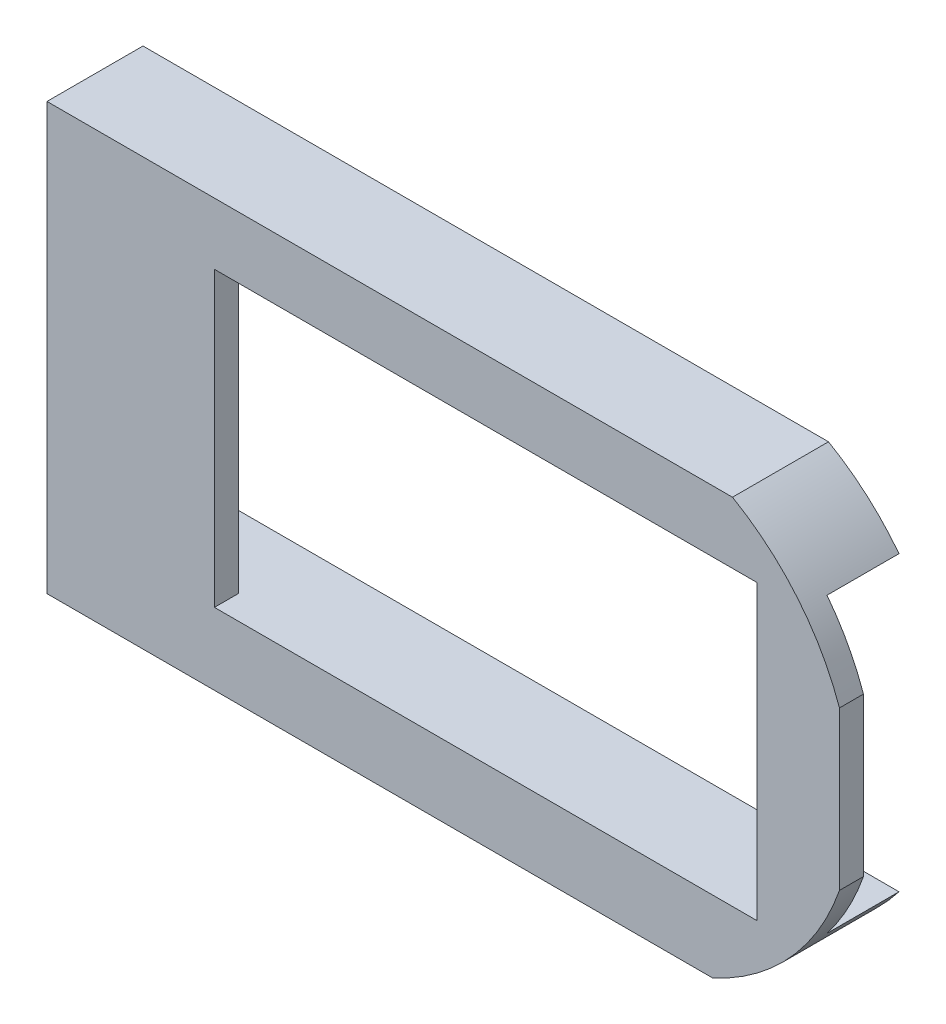
ISO-10303-21;
HEADER;
FILE_DESCRIPTION(('STEP AP214'),'2;1');
FILE_NAME('part.step','',(''),(''),'','','');
FILE_SCHEMA(('AUTOMOTIVE_DESIGN { 1 0 10303 214 1 1 1 1 }'));
ENDSEC;
DATA;
#1=APPLICATION_CONTEXT('core data for automotive mechanical design processes');
#2=APPLICATION_PROTOCOL_DEFINITION('international standard','automotive_design',2000,#1);
#3=PRODUCT_CONTEXT('',#1,'mechanical');
#4=PRODUCT('Part','Part','',(#3));
#5=PRODUCT_RELATED_PRODUCT_CATEGORY('part','',(#4));
#6=PRODUCT_DEFINITION_FORMATION('','',#4);
#7=PRODUCT_DEFINITION_CONTEXT('part definition',#1,'design');
#8=PRODUCT_DEFINITION('design','',#6,#7);
#9=PRODUCT_DEFINITION_SHAPE('','',#8);
#10=(LENGTH_UNIT() NAMED_UNIT(*) SI_UNIT(.MILLI.,.METRE.));
#11=(NAMED_UNIT(*) PLANE_ANGLE_UNIT() SI_UNIT($,.RADIAN.));
#12=(NAMED_UNIT(*) SI_UNIT($,.STERADIAN.) SOLID_ANGLE_UNIT());
#13=UNCERTAINTY_MEASURE_WITH_UNIT(LENGTH_MEASURE(1.E-05),#10,'distance_accuracy_value','');
#14=(GEOMETRIC_REPRESENTATION_CONTEXT(3) GLOBAL_UNCERTAINTY_ASSIGNED_CONTEXT((#13)) GLOBAL_UNIT_ASSIGNED_CONTEXT((#10,
#11,#12)) REPRESENTATION_CONTEXT('',''));
#15=CARTESIAN_POINT('',(0.,0.,0.));
#16=DIRECTION('',(0.,0.,1.));
#17=DIRECTION('',(1.,0.,0.));
#18=AXIS2_PLACEMENT_3D('',#15,#16,#17);
#19=CARTESIAN_POINT('',(80.,0.,23.5));
#20=DIRECTION('',(0.,0.,-1.));
#21=DIRECTION('',(-1.,0.,0.));
#22=AXIS2_PLACEMENT_3D('',#19,#20,#21);
#23=CYLINDRICAL_SURFACE('',#22,10.);
#24=DIRECTION('',(0.,0.,-1.));
#25=VECTOR('',#24,1.);
#26=CARTESIAN_POINT('',(84.9859105930687,8.66837329364195,23.5));
#27=LINE('',#26,#25);
#28=CARTESIAN_POINT('',(84.9859105930687,8.66837329364195,17.5));
#29=VERTEX_POINT('',#28);
#30=CARTESIAN_POINT('',(84.9859105930687,8.66837329364195,21.5));
#31=VERTEX_POINT('',#30);
#32=EDGE_CURVE('E561',#29,#31,#27,.F.);
#33=ORIENTED_EDGE('',*,*,#32,.T.);
#34=CARTESIAN_POINT('',(80.,0.,21.5));
#35=DIRECTION('',(0.,0.,1.));
#36=DIRECTION('',(1.,0.,0.));
#37=AXIS2_PLACEMENT_3D('',#34,#35,#36);
#38=CIRCLE('',#37,10.);
#39=CARTESIAN_POINT('',(89.4424999218973,3.29229330785836,21.5));
#40=VERTEX_POINT('',#39);
#41=EDGE_CURVE('E527',#31,#40,#38,.F.);
#42=ORIENTED_EDGE('',*,*,#41,.T.);
#43=DIRECTION('',(0.,0.,-1.));
#44=VECTOR('',#43,1.);
#45=CARTESIAN_POINT('',(89.4424999218973,3.29229330785836,23.5));
#46=LINE('',#45,#44);
#47=CARTESIAN_POINT('',(89.4424999218973,3.29229330785836,20.5));
#48=VERTEX_POINT('',#47);
#49=EDGE_CURVE('E547',#40,#48,#46,.T.);
#50=ORIENTED_EDGE('',*,*,#49,.T.);
#51=CARTESIAN_POINT('',(80.,0.,20.5));
#52=DIRECTION('',(0.,0.,1.));
#53=DIRECTION('',(1.,0.,0.));
#54=AXIS2_PLACEMENT_3D('',#51,#52,#53);
#55=CIRCLE('',#54,10.);
#56=CARTESIAN_POINT('',(87.924014134263,6.1,20.5));
#57=VERTEX_POINT('',#56);
#58=EDGE_CURVE('E587',#57,#48,#55,.F.);
#59=ORIENTED_EDGE('',*,*,#58,.F.);
#60=DIRECTION('',(0.,0.,-1.));
#61=VECTOR('',#60,1.);
#62=CARTESIAN_POINT('',(87.924014134263,6.1,23.5));
#63=LINE('',#62,#61);
#64=CARTESIAN_POINT('',(87.924014134263,6.1,17.5));
#65=VERTEX_POINT('',#64);
#66=EDGE_CURVE('E593',#65,#57,#63,.F.);
#67=ORIENTED_EDGE('',*,*,#66,.F.);
#68=CARTESIAN_POINT('',(80.,0.,17.5));
#69=DIRECTION('',(0.,0.,1.));
#70=DIRECTION('',(1.,0.,0.));
#71=AXIS2_PLACEMENT_3D('',#68,#69,#70);
#72=CIRCLE('',#71,10.);
#73=EDGE_CURVE('E625',#29,#65,#72,.F.);
#74=ORIENTED_EDGE('',*,*,#73,.F.);
#75=EDGE_LOOP('',(#33,#42,#50,#59,#67,#74));
#76=FACE_BOUND('',#75,.T.);
#77=ADVANCED_FACE('F424',(#76),#23,.T.);
#78=DIRECTION('',(0.,0.,-1.));
#79=VECTOR('',#78,1.);
#80=CARTESIAN_POINT('',(89.4424999218973,-3.29229330785836,23.5));
#81=LINE('',#80,#79);
#82=CARTESIAN_POINT('',(89.4424999218973,-3.29229330785836,20.5));
#83=VERTEX_POINT('',#82);
#84=CARTESIAN_POINT('',(89.4424999218973,-3.29229330785836,21.5));
#85=VERTEX_POINT('',#84);
#86=EDGE_CURVE('E558',#83,#85,#81,.F.);
#87=ORIENTED_EDGE('',*,*,#86,.T.);
#88=CARTESIAN_POINT('',(80.,0.,21.5));
#89=DIRECTION('',(0.,0.,1.));
#90=DIRECTION('',(1.,0.,0.));
#91=AXIS2_PLACEMENT_3D('',#88,#89,#90);
#92=CIRCLE('',#91,10.);
#93=CARTESIAN_POINT('',(84.1595211796978,-9.09386516040595,21.5));
#94=VERTEX_POINT('',#93);
#95=EDGE_CURVE('E446',#85,#94,#92,.F.);
#96=ORIENTED_EDGE('',*,*,#95,.T.);
#97=DIRECTION('',(0.,0.,-1.));
#98=VECTOR('',#97,1.);
#99=CARTESIAN_POINT('',(84.1595211796978,-9.09386516040595,23.5));
#100=LINE('',#99,#98);
#101=CARTESIAN_POINT('',(84.1595211796978,-9.09386516040595,17.5));
#102=VERTEX_POINT('',#101);
#103=EDGE_CURVE('E545',#94,#102,#100,.T.);
#104=ORIENTED_EDGE('',*,*,#103,.T.);
#105=CARTESIAN_POINT('',(80.,0.,17.5));
#106=DIRECTION('',(0.,0.,1.));
#107=DIRECTION('',(1.,0.,0.));
#108=AXIS2_PLACEMENT_3D('',#105,#106,#107);
#109=CIRCLE('',#108,10.);
#110=CARTESIAN_POINT('',(87.924014134263,-6.1,17.5));
#111=VERTEX_POINT('',#110);
#112=EDGE_CURVE('E623',#111,#102,#109,.F.);
#113=ORIENTED_EDGE('',*,*,#112,.F.);
#114=DIRECTION('',(0.,0.,-1.));
#115=VECTOR('',#114,1.);
#116=CARTESIAN_POINT('',(87.924014134263,-6.1,23.5));
#117=LINE('',#116,#115);
#118=CARTESIAN_POINT('',(87.924014134263,-6.1,20.5));
#119=VERTEX_POINT('',#118);
#120=EDGE_CURVE('E590',#119,#111,#117,.T.);
#121=ORIENTED_EDGE('',*,*,#120,.F.);
#122=EDGE_CURVE('E585',#83,#119,#55,.F.);
#123=ORIENTED_EDGE('',*,*,#122,.F.);
#124=EDGE_LOOP('',(#87,#96,#104,#113,#121,#123));
#125=FACE_BOUND('',#124,.T.);
#126=ADVANCED_FACE('F670',(#125),#23,.T.);
#127=CARTESIAN_POINT('',(0.,-6.1,-46.6829504163593));
#128=DIRECTION('',(0.,-1.,0.));
#129=DIRECTION('',(0.,0.,-1.));
#130=AXIS2_PLACEMENT_3D('',#127,#128,#129);
#131=PLANE('',#130);
#132=DIRECTION('',(-1.,0.,0.));
#133=VECTOR('',#132,1.);
#134=CARTESIAN_POINT('',(0.,-6.1,21.5));
#135=LINE('',#134,#133);
#136=CARTESIAN_POINT('',(86.,-6.1,21.5));
#137=VERTEX_POINT('',#136);
#138=CARTESIAN_POINT('',(63.4,-6.1,21.5));
#139=VERTEX_POINT('',#138);
#140=EDGE_CURVE('E438',#137,#139,#135,.T.);
#141=ORIENTED_EDGE('',*,*,#140,.F.);
#142=DIRECTION('',(0.,0.,-1.));
#143=VECTOR('',#142,1.);
#144=CARTESIAN_POINT('',(86.,-6.1,23.5));
#145=LINE('',#144,#143);
#146=CARTESIAN_POINT('',(86.,-6.1,20.5));
#147=VERTEX_POINT('',#146);
#148=EDGE_CURVE('E563',#137,#147,#145,.T.);
#149=ORIENTED_EDGE('',*,*,#148,.T.);
#150=DIRECTION('',(1.,0.,0.));
#151=VECTOR('',#150,1.);
#152=CARTESIAN_POINT('',(0.,-6.1,20.5));
#153=LINE('',#152,#151);
#154=EDGE_CURVE('E574',#147,#119,#153,.T.);
#155=ORIENTED_EDGE('',*,*,#154,.T.);
#156=ORIENTED_EDGE('',*,*,#120,.T.);
#157=DIRECTION('',(-1.,0.,0.));
#158=VECTOR('',#157,1.);
#159=CARTESIAN_POINT('',(0.,-6.1,17.5));
#160=LINE('',#159,#158);
#161=CARTESIAN_POINT('',(58.2,-6.1,17.5));
#162=VERTEX_POINT('',#161);
#163=EDGE_CURVE('E629',#111,#162,#160,.T.);
#164=ORIENTED_EDGE('',*,*,#163,.T.);
#165=DIRECTION('',(0.,0.,1.));
#166=VECTOR('',#165,1.);
#167=CARTESIAN_POINT('',(58.2,-6.1,-46.6829504163593));
#168=LINE('',#167,#166);
#169=CARTESIAN_POINT('',(58.2,-6.1,20.5));
#170=VERTEX_POINT('',#169);
#171=EDGE_CURVE('E582',#162,#170,#168,.T.);
#172=ORIENTED_EDGE('',*,*,#171,.T.);
#173=CARTESIAN_POINT('',(63.4,-6.1,20.5));
#174=VERTEX_POINT('',#173);
#175=EDGE_CURVE('E575',#170,#174,#153,.T.);
#176=ORIENTED_EDGE('',*,*,#175,.T.);
#177=DIRECTION('',(0.,0.,-1.));
#178=VECTOR('',#177,1.);
#179=CARTESIAN_POINT('',(63.4,-6.1,23.5));
#180=LINE('',#179,#178);
#181=EDGE_CURVE('E569',#139,#174,#180,.T.);
#182=ORIENTED_EDGE('',*,*,#181,.F.);
#183=EDGE_LOOP('',(#141,#149,#155,#156,#164,#172,#176,#182));
#184=FACE_BOUND('',#183,.T.);
#185=ADVANCED_FACE('F650',(#184),#131,.F.);
#186=CARTESIAN_POINT('',(0.,6.09999999999999,-46.6829504163593));
#187=DIRECTION('',(0.,1.,0.));
#188=DIRECTION('',(-1.,0.,0.));
#189=AXIS2_PLACEMENT_3D('',#186,#187,#188);
#190=PLANE('',#189);
#191=DIRECTION('',(1.,0.,0.));
#192=VECTOR('',#191,1.);
#193=CARTESIAN_POINT('',(0.,6.09999999999999,21.5));
#194=LINE('',#193,#192);
#195=CARTESIAN_POINT('',(63.4,6.1,21.5));
#196=VERTEX_POINT('',#195);
#197=CARTESIAN_POINT('',(86.,6.1,21.5));
#198=VERTEX_POINT('',#197);
#199=EDGE_CURVE('E612',#196,#198,#194,.T.);
#200=ORIENTED_EDGE('',*,*,#199,.F.);
#201=DIRECTION('',(0.,0.,-1.));
#202=VECTOR('',#201,1.);
#203=CARTESIAN_POINT('',(63.4,6.1,23.5));
#204=LINE('',#203,#202);
#205=CARTESIAN_POINT('',(63.4,6.1,20.5));
#206=VERTEX_POINT('',#205);
#207=EDGE_CURVE('E567',#196,#206,#204,.T.);
#208=ORIENTED_EDGE('',*,*,#207,.T.);
#209=DIRECTION('',(-1.,0.,0.));
#210=VECTOR('',#209,1.);
#211=CARTESIAN_POINT('',(0.,6.10000000000001,20.5));
#212=LINE('',#211,#210);
#213=CARTESIAN_POINT('',(58.2,6.1,20.5));
#214=VERTEX_POINT('',#213);
#215=EDGE_CURVE('E578',#206,#214,#212,.T.);
#216=ORIENTED_EDGE('',*,*,#215,.T.);
#217=DIRECTION('',(0.,0.,1.));
#218=VECTOR('',#217,1.);
#219=CARTESIAN_POINT('',(58.2,6.1,-46.6829504163593));
#220=LINE('',#219,#218);
#221=CARTESIAN_POINT('',(58.2,6.1,17.5));
#222=VERTEX_POINT('',#221);
#223=EDGE_CURVE('E583',#222,#214,#220,.T.);
#224=ORIENTED_EDGE('',*,*,#223,.F.);
#225=DIRECTION('',(1.,0.,0.));
#226=VECTOR('',#225,1.);
#227=CARTESIAN_POINT('',(0.,6.09999999999999,17.5));
#228=LINE('',#227,#226);
#229=EDGE_CURVE('E627',#222,#65,#228,.T.);
#230=ORIENTED_EDGE('',*,*,#229,.T.);
#231=ORIENTED_EDGE('',*,*,#66,.T.);
#232=CARTESIAN_POINT('',(86.,6.1,20.5));
#233=VERTEX_POINT('',#232);
#234=EDGE_CURVE('E579',#57,#233,#212,.T.);
#235=ORIENTED_EDGE('',*,*,#234,.T.);
#236=DIRECTION('',(0.,0.,-1.));
#237=VECTOR('',#236,1.);
#238=CARTESIAN_POINT('',(86.,6.1,23.5));
#239=LINE('',#238,#237);
#240=EDGE_CURVE('E564',#198,#233,#239,.T.);
#241=ORIENTED_EDGE('',*,*,#240,.F.);
#242=EDGE_LOOP('',(#200,#208,#216,#224,#230,#231,#235,#241));
#243=FACE_BOUND('',#242,.T.);
#244=ADVANCED_FACE('F640',(#243),#190,.F.);
#245=CARTESIAN_POINT('',(86.,6.1,23.5));
#246=DIRECTION('',(1.,0.,0.));
#247=DIRECTION('',(0.,0.,-1.));
#248=AXIS2_PLACEMENT_3D('',#245,#246,#247);
#249=PLANE('',#248);
#250=DIRECTION('',(0.,-1.,0.));
#251=VECTOR('',#250,1.);
#252=CARTESIAN_POINT('',(86.,6.1,21.5));
#253=LINE('',#252,#251);
#254=EDGE_CURVE('E619',#198,#137,#253,.T.);
#255=ORIENTED_EDGE('',*,*,#254,.F.);
#256=ORIENTED_EDGE('',*,*,#240,.T.);
#257=DIRECTION('',(0.,1.,0.));
#258=VECTOR('',#257,1.);
#259=CARTESIAN_POINT('',(86.,0.,20.5));
#260=LINE('',#259,#258);
#261=EDGE_CURVE('E598',#147,#233,#260,.T.);
#262=ORIENTED_EDGE('',*,*,#261,.F.);
#263=ORIENTED_EDGE('',*,*,#148,.F.);
#264=EDGE_LOOP('',(#255,#256,#262,#263));
#265=FACE_BOUND('',#264,.T.);
#266=ADVANCED_FACE('F659',(#265),#249,.F.);
#267=CARTESIAN_POINT('',(63.4,6.1,23.5));
#268=DIRECTION('',(-1.,0.,0.));
#269=DIRECTION('',(0.,0.,1.));
#270=AXIS2_PLACEMENT_3D('',#267,#268,#269);
#271=PLANE('',#270);
#272=DIRECTION('',(0.,1.,0.));
#273=VECTOR('',#272,1.);
#274=CARTESIAN_POINT('',(63.4,6.1,21.5));
#275=LINE('',#274,#273);
#276=EDGE_CURVE('E610',#139,#196,#275,.T.);
#277=ORIENTED_EDGE('',*,*,#276,.F.);
#278=ORIENTED_EDGE('',*,*,#181,.T.);
#279=DIRECTION('',(0.,-1.,0.));
#280=VECTOR('',#279,1.);
#281=CARTESIAN_POINT('',(63.4,0.,20.5));
#282=LINE('',#281,#280);
#283=EDGE_CURVE('E595',#206,#174,#282,.T.);
#284=ORIENTED_EDGE('',*,*,#283,.F.);
#285=ORIENTED_EDGE('',*,*,#207,.F.);
#286=EDGE_LOOP('',(#277,#278,#284,#285));
#287=FACE_BOUND('',#286,.T.);
#288=ADVANCED_FACE('F653',(#287),#271,.F.);
#289=CARTESIAN_POINT('',(56.4237927175313,-9.09386516040595,-22.1025588832576));
#290=DIRECTION('',(0.,-1.,0.));
#291=DIRECTION('',(0.,0.,-1.));
#292=AXIS2_PLACEMENT_3D('',#289,#290,#291);
#293=PLANE('',#292);
#294=ORIENTED_EDGE('',*,*,#103,.F.);
#295=DIRECTION('',(-1.,0.,0.));
#296=VECTOR('',#295,1.);
#297=CARTESIAN_POINT('',(56.4237927175313,-9.09386516040595,21.5));
#298=LINE('',#297,#296);
#299=CARTESIAN_POINT('',(56.4237927175313,-9.09386516040595,21.5));
#300=VERTEX_POINT('',#299);
#301=EDGE_CURVE('E609',#94,#300,#298,.T.);
#302=ORIENTED_EDGE('',*,*,#301,.T.);
#303=DIRECTION('',(0.,0.,1.));
#304=VECTOR('',#303,1.);
#305=CARTESIAN_POINT('',(56.4237927175313,-9.09386516040595,-22.1025588832576));
#306=LINE('',#305,#304);
#307=CARTESIAN_POINT('',(56.4237927175313,-9.09386516040595,17.5));
#308=VERTEX_POINT('',#307);
#309=EDGE_CURVE('E540',#308,#300,#306,.T.);
#310=ORIENTED_EDGE('',*,*,#309,.F.);
#311=DIRECTION('',(-1.,0.,0.));
#312=VECTOR('',#311,1.);
#313=CARTESIAN_POINT('',(56.4237927175313,-9.09386516040595,17.5));
#314=LINE('',#313,#312);
#315=EDGE_CURVE('E605',#102,#308,#314,.T.);
#316=ORIENTED_EDGE('',*,*,#315,.F.);
#317=EDGE_LOOP('',(#294,#302,#310,#316));
#318=FACE_BOUND('',#317,.T.);
#319=ADVANCED_FACE('F608',(#318),#293,.T.);
#320=CARTESIAN_POINT('',(56.4237927175313,8.66837329364195,-22.1025588832576));
#321=DIRECTION('',(0.,1.,0.));
#322=DIRECTION('',(0.,0.,1.));
#323=AXIS2_PLACEMENT_3D('',#320,#321,#322);
#324=PLANE('',#323);
#325=DIRECTION('',(0.,0.,1.));
#326=VECTOR('',#325,1.);
#327=CARTESIAN_POINT('',(56.4237927175313,8.66837329364195,-22.1025588832576));
#328=LINE('',#327,#326);
#329=CARTESIAN_POINT('',(56.4237927175313,8.66837329364195,17.5));
#330=VERTEX_POINT('',#329);
#331=CARTESIAN_POINT('',(56.4237927175313,8.66837329364195,21.5));
#332=VERTEX_POINT('',#331);
#333=EDGE_CURVE('E538',#330,#332,#328,.T.);
#334=ORIENTED_EDGE('',*,*,#333,.T.);
#335=DIRECTION('',(-1.,0.,0.));
#336=VECTOR('',#335,1.);
#337=CARTESIAN_POINT('',(56.4237927175313,8.66837329364195,21.5));
#338=LINE('',#337,#336);
#339=EDGE_CURVE('E521',#31,#332,#338,.T.);
#340=ORIENTED_EDGE('',*,*,#339,.F.);
#341=ORIENTED_EDGE('',*,*,#32,.F.);
#342=DIRECTION('',(1.,0.,0.));
#343=VECTOR('',#342,1.);
#344=CARTESIAN_POINT('',(56.4237927175313,8.66837329364195,17.5));
#345=LINE('',#344,#343);
#346=EDGE_CURVE('E544',#330,#29,#345,.T.);
#347=ORIENTED_EDGE('',*,*,#346,.F.);
#348=EDGE_LOOP('',(#334,#340,#341,#347));
#349=FACE_BOUND('',#348,.T.);
#350=ADVANCED_FACE('F543',(#349),#324,.T.);
#351=CARTESIAN_POINT('',(56.4237927175313,8.66837329364195,-22.1025588832576));
#352=DIRECTION('',(-1.,0.,0.));
#353=DIRECTION('',(0.,0.,1.));
#354=AXIS2_PLACEMENT_3D('',#351,#352,#353);
#355=PLANE('',#354);
#356=ORIENTED_EDGE('',*,*,#309,.T.);
#357=DIRECTION('',(0.,-1.,0.));
#358=VECTOR('',#357,1.);
#359=CARTESIAN_POINT('',(56.4237927175313,8.66837329364195,21.5));
#360=LINE('',#359,#358);
#361=EDGE_CURVE('E524',#332,#300,#360,.T.);
#362=ORIENTED_EDGE('',*,*,#361,.F.);
#363=ORIENTED_EDGE('',*,*,#333,.F.);
#364=DIRECTION('',(0.,1.,0.));
#365=VECTOR('',#364,1.);
#366=CARTESIAN_POINT('',(56.4237927175313,8.66837329364195,17.5));
#367=LINE('',#366,#365);
#368=EDGE_CURVE('E431',#308,#330,#367,.T.);
#369=ORIENTED_EDGE('',*,*,#368,.F.);
#370=EDGE_LOOP('',(#356,#362,#363,#369));
#371=FACE_BOUND('',#370,.T.);
#372=ADVANCED_FACE('F536',(#371),#355,.T.);
#373=CARTESIAN_POINT('',(89.4424999218973,8.66837329364195,-22.1025588832576));
#374=DIRECTION('',(1.,0.,0.));
#375=DIRECTION('',(0.,0.,-1.));
#376=AXIS2_PLACEMENT_3D('',#373,#374,#375);
#377=PLANE('',#376);
#378=ORIENTED_EDGE('',*,*,#49,.F.);
#379=DIRECTION('',(0.,-1.,0.));
#380=VECTOR('',#379,1.);
#381=CARTESIAN_POINT('',(89.4424999218973,8.66837329364195,21.5));
#382=LINE('',#381,#380);
#383=EDGE_CURVE('E15',#40,#85,#382,.T.);
#384=ORIENTED_EDGE('',*,*,#383,.T.);
#385=ORIENTED_EDGE('',*,*,#86,.F.);
#386=DIRECTION('',(0.,1.,0.));
#387=VECTOR('',#386,1.);
#388=CARTESIAN_POINT('',(89.4424999218973,0.,20.5));
#389=LINE('',#388,#387);
#390=EDGE_CURVE('E555',#83,#48,#389,.T.);
#391=ORIENTED_EDGE('',*,*,#390,.T.);
#392=EDGE_LOOP('',(#378,#384,#385,#391));
#393=FACE_BOUND('',#392,.T.);
#394=ADVANCED_FACE('F673',(#393),#377,.T.);
#395=CARTESIAN_POINT('',(0.,0.,20.5));
#396=DIRECTION('',(0.,0.,1.));
#397=DIRECTION('',(1.,0.,0.));
#398=AXIS2_PLACEMENT_3D('',#395,#396,#397);
#399=PLANE('',#398);
#400=ORIENTED_EDGE('',*,*,#390,.F.);
#401=ORIENTED_EDGE('',*,*,#122,.T.);
#402=ORIENTED_EDGE('',*,*,#154,.F.);
#403=ORIENTED_EDGE('',*,*,#261,.T.);
#404=ORIENTED_EDGE('',*,*,#234,.F.);
#405=ORIENTED_EDGE('',*,*,#58,.T.);
#406=EDGE_LOOP('',(#400,#401,#402,#403,#404,#405));
#407=FACE_BOUND('',#406,.T.);
#408=ADVANCED_FACE('F663',(#407),#399,.F.);
#409=CARTESIAN_POINT('',(58.2,0.,-46.6829504163593));
#410=DIRECTION('',(-1.,0.,0.));
#411=DIRECTION('',(0.,0.,1.));
#412=AXIS2_PLACEMENT_3D('',#409,#410,#411);
#413=PLANE('',#412);
#414=ORIENTED_EDGE('',*,*,#171,.F.);
#415=DIRECTION('',(0.,1.,0.));
#416=VECTOR('',#415,1.);
#417=CARTESIAN_POINT('',(58.2,0.,17.5));
#418=LINE('',#417,#416);
#419=EDGE_CURVE('E549',#162,#222,#418,.T.);
#420=ORIENTED_EDGE('',*,*,#419,.T.);
#421=ORIENTED_EDGE('',*,*,#223,.T.);
#422=DIRECTION('',(0.,-1.,0.));
#423=VECTOR('',#422,1.);
#424=CARTESIAN_POINT('',(58.2,0.,20.5));
#425=LINE('',#424,#423);
#426=EDGE_CURVE('E566',#214,#170,#425,.T.);
#427=ORIENTED_EDGE('',*,*,#426,.T.);
#428=EDGE_LOOP('',(#414,#420,#421,#427));
#429=FACE_BOUND('',#428,.T.);
#430=ADVANCED_FACE('F636',(#429),#413,.F.);
#431=ORIENTED_EDGE('',*,*,#215,.F.);
#432=ORIENTED_EDGE('',*,*,#283,.T.);
#433=ORIENTED_EDGE('',*,*,#175,.F.);
#434=ORIENTED_EDGE('',*,*,#426,.F.);
#435=EDGE_LOOP('',(#431,#432,#433,#434));
#436=FACE_BOUND('',#435,.T.);
#437=ADVANCED_FACE('F648',(#436),#399,.F.);
#438=CARTESIAN_POINT('',(0.,0.,17.5));
#439=DIRECTION('',(0.,0.,1.));
#440=DIRECTION('',(1.,0.,0.));
#441=AXIS2_PLACEMENT_3D('',#438,#439,#440);
#442=PLANE('',#441);
#443=ORIENTED_EDGE('',*,*,#163,.F.);
#444=ORIENTED_EDGE('',*,*,#112,.T.);
#445=ORIENTED_EDGE('',*,*,#315,.T.);
#446=ORIENTED_EDGE('',*,*,#368,.T.);
#447=ORIENTED_EDGE('',*,*,#346,.T.);
#448=ORIENTED_EDGE('',*,*,#73,.T.);
#449=ORIENTED_EDGE('',*,*,#229,.F.);
#450=ORIENTED_EDGE('',*,*,#419,.F.);
#451=EDGE_LOOP('',(#443,#444,#445,#446,#447,#448,#449,#450));
#452=FACE_BOUND('',#451,.T.);
#453=ADVANCED_FACE('F601',(#452),#442,.F.);
#454=CARTESIAN_POINT('',(0.,0.,21.5));
#455=DIRECTION('',(0.,0.,1.));
#456=DIRECTION('',(1.,0.,0.));
#457=AXIS2_PLACEMENT_3D('',#454,#455,#456);
#458=PLANE('',#457);
#459=ORIENTED_EDGE('',*,*,#95,.F.);
#460=ORIENTED_EDGE('',*,*,#383,.F.);
#461=ORIENTED_EDGE('',*,*,#41,.F.);
#462=ORIENTED_EDGE('',*,*,#339,.T.);
#463=ORIENTED_EDGE('',*,*,#361,.T.);
#464=ORIENTED_EDGE('',*,*,#301,.F.);
#465=EDGE_LOOP('',(#459,#460,#461,#462,#463,#464));
#466=FACE_BOUND('',#465,.T.);
#467=ORIENTED_EDGE('',*,*,#254,.T.);
#468=ORIENTED_EDGE('',*,*,#140,.T.);
#469=ORIENTED_EDGE('',*,*,#276,.T.);
#470=ORIENTED_EDGE('',*,*,#199,.T.);
#471=EDGE_LOOP('',(#467,#468,#469,#470));
#472=FACE_BOUND('',#471,.T.);
#473=ADVANCED_FACE('F523',(#466,#472),#458,.T.);
#474=CLOSED_SHELL('',(#77,#126,#185,#244,#266,#288,#319,#350,#372,#394,#408,#430,#437,#453,#473));
#475=MANIFOLD_SOLID_BREP('B2',#474);
#476=ADVANCED_BREP_SHAPE_REPRESENTATION('',(#18,#475),#14);
#477=SHAPE_DEFINITION_REPRESENTATION(#9,#476);
ENDSEC;
END-ISO-10303-21;
